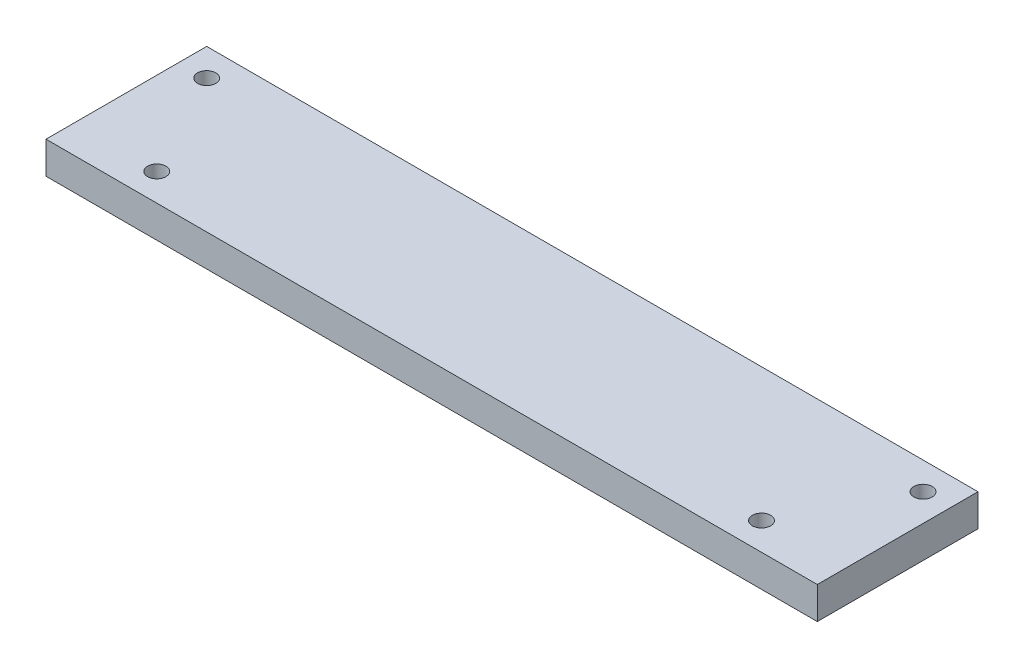
ISO-10303-21;
HEADER;
FILE_DESCRIPTION(('STEP AP214'),'2;1');
FILE_NAME('part.step','',(''),(''),'','','');
FILE_SCHEMA(('AUTOMOTIVE_DESIGN { 1 0 10303 214 1 1 1 1 }'));
ENDSEC;
DATA;
#1=APPLICATION_CONTEXT('core data for automotive mechanical design processes');
#2=APPLICATION_PROTOCOL_DEFINITION('international standard','automotive_design',2000,#1);
#3=PRODUCT_CONTEXT('',#1,'mechanical');
#4=PRODUCT('Part','Part','',(#3));
#5=PRODUCT_RELATED_PRODUCT_CATEGORY('part','',(#4));
#6=PRODUCT_DEFINITION_FORMATION('','',#4);
#7=PRODUCT_DEFINITION_CONTEXT('part definition',#1,'design');
#8=PRODUCT_DEFINITION('design','',#6,#7);
#9=PRODUCT_DEFINITION_SHAPE('','',#8);
#10=(LENGTH_UNIT() NAMED_UNIT(*) SI_UNIT(.MILLI.,.METRE.));
#11=(NAMED_UNIT(*) PLANE_ANGLE_UNIT() SI_UNIT($,.RADIAN.));
#12=(NAMED_UNIT(*) SI_UNIT($,.STERADIAN.) SOLID_ANGLE_UNIT());
#13=UNCERTAINTY_MEASURE_WITH_UNIT(LENGTH_MEASURE(1.E-05),#10,'distance_accuracy_value','');
#14=(GEOMETRIC_REPRESENTATION_CONTEXT(3) GLOBAL_UNCERTAINTY_ASSIGNED_CONTEXT((#13)) GLOBAL_UNIT_ASSIGNED_CONTEXT((#10,
#11,#12)) REPRESENTATION_CONTEXT('',''));
#15=CARTESIAN_POINT('',(0.,0.,0.));
#16=DIRECTION('',(0.,0.,1.));
#17=DIRECTION('',(1.,0.,0.));
#18=AXIS2_PLACEMENT_3D('',#15,#16,#17);
#19=CARTESIAN_POINT('',(0.,12.7,0.));
#20=DIRECTION('',(0.,-1.,0.));
#21=DIRECTION('',(0.,0.,-1.));
#22=AXIS2_PLACEMENT_3D('',#19,#20,#21);
#23=PLANE('',#22);
#24=DIRECTION('',(0.,0.,1.));
#25=VECTOR('',#24,1.);
#26=CARTESIAN_POINT('',(0.,12.7,0.));
#27=LINE('',#26,#25);
#28=CARTESIAN_POINT('',(0.,12.7,-63.5));
#29=VERTEX_POINT('',#28);
#30=CARTESIAN_POINT('',(0.,12.7,0.));
#31=VERTEX_POINT('',#30);
#32=EDGE_CURVE('E84',#29,#31,#27,.T.);
#33=ORIENTED_EDGE('',*,*,#32,.T.);
#34=DIRECTION('',(1.,0.,0.));
#35=VECTOR('',#34,1.);
#36=CARTESIAN_POINT('',(0.,12.7,0.));
#37=LINE('',#36,#35);
#38=CARTESIAN_POINT('',(304.8,12.7,0.));
#39=VERTEX_POINT('',#38);
#40=EDGE_CURVE('E79',#31,#39,#37,.T.);
#41=ORIENTED_EDGE('',*,*,#40,.T.);
#42=DIRECTION('',(0.,0.,-1.));
#43=VECTOR('',#42,1.);
#44=CARTESIAN_POINT('',(304.8,12.7,0.));
#45=LINE('',#44,#43);
#46=CARTESIAN_POINT('',(304.8,12.7,-63.5));
#47=VERTEX_POINT('',#46);
#48=EDGE_CURVE('E82',#39,#47,#45,.T.);
#49=ORIENTED_EDGE('',*,*,#48,.T.);
#50=DIRECTION('',(-1.,0.,0.));
#51=VECTOR('',#50,1.);
#52=CARTESIAN_POINT('',(0.,12.7,-63.5));
#53=LINE('',#52,#51);
#54=EDGE_CURVE('E49',#47,#29,#53,.T.);
#55=ORIENTED_EDGE('',*,*,#54,.T.);
#56=EDGE_LOOP('',(#33,#41,#49,#55));
#57=FACE_BOUND('',#56,.T.);
#58=CARTESIAN_POINT('',(293.9415,12.7,-52.6415));
#59=DIRECTION('',(0.,1.,0.));
#60=DIRECTION('',(0.,0.,1.));
#61=AXIS2_PLACEMENT_3D('',#58,#59,#60);
#62=CIRCLE('',#61,3.61949999999999);
#63=CARTESIAN_POINT('',(293.9415,12.7,-49.022));
#64=VERTEX_POINT('',#63);
#65=EDGE_CURVE('E99',#64,#64,#62,.T.);
#66=ORIENTED_EDGE('',*,*,#65,.F.);
#67=EDGE_LOOP('',(#66));
#68=FACE_BOUND('',#67,.T.);
#69=CARTESIAN_POINT('',(271.892090778889,12.7,-10.8585));
#70=DIRECTION('',(0.,1.,0.));
#71=DIRECTION('',(0.,0.,1.));
#72=AXIS2_PLACEMENT_3D('',#69,#70,#71);
#73=CIRCLE('',#72,3.61949999999999);
#74=CARTESIAN_POINT('',(271.892090778889,12.7,-7.23900000000001));
#75=VERTEX_POINT('',#74);
#76=EDGE_CURVE('E114',#75,#75,#73,.T.);
#77=ORIENTED_EDGE('',*,*,#76,.F.);
#78=EDGE_LOOP('',(#77));
#79=FACE_BOUND('',#78,.T.);
#80=CARTESIAN_POINT('',(32.9079092211106,12.7,-10.8585));
#81=DIRECTION('',(0.,1.,0.));
#82=DIRECTION('',(0.,0.,-1.));
#83=AXIS2_PLACEMENT_3D('',#80,#81,#82);
#84=CIRCLE('',#83,3.6195);
#85=CARTESIAN_POINT('',(32.9079092211106,12.7,-14.478));
#86=VERTEX_POINT('',#85);
#87=EDGE_CURVE('E120',#86,#86,#84,.T.);
#88=ORIENTED_EDGE('',*,*,#87,.F.);
#89=EDGE_LOOP('',(#88));
#90=FACE_BOUND('',#89,.T.);
#91=CARTESIAN_POINT('',(10.8585,12.7,-52.6415));
#92=DIRECTION('',(0.,1.,0.));
#93=DIRECTION('',(0.,0.,-1.));
#94=AXIS2_PLACEMENT_3D('',#91,#92,#93);
#95=CIRCLE('',#94,3.6195);
#96=CARTESIAN_POINT('',(10.8585,12.7,-56.261));
#97=VERTEX_POINT('',#96);
#98=EDGE_CURVE('E126',#97,#97,#95,.T.);
#99=ORIENTED_EDGE('',*,*,#98,.F.);
#100=EDGE_LOOP('',(#99));
#101=FACE_BOUND('',#100,.T.);
#102=ADVANCED_FACE('F32',(#57,#68,#79,#90,#101),#23,.F.);
#103=CARTESIAN_POINT('',(0.,0.,0.));
#104=DIRECTION('',(0.,-1.,0.));
#105=DIRECTION('',(0.,0.,-1.));
#106=AXIS2_PLACEMENT_3D('',#103,#104,#105);
#107=PLANE('',#106);
#108=CARTESIAN_POINT('',(32.9079092211106,0.,-10.8585));
#109=DIRECTION('',(0.,1.,0.));
#110=DIRECTION('',(0.,0.,-1.));
#111=AXIS2_PLACEMENT_3D('',#108,#109,#110);
#112=CIRCLE('',#111,3.6195);
#113=CARTESIAN_POINT('',(32.9079092211106,0.,-14.478));
#114=VERTEX_POINT('',#113);
#115=EDGE_CURVE('E123',#114,#114,#112,.T.);
#116=ORIENTED_EDGE('',*,*,#115,.T.);
#117=EDGE_LOOP('',(#116));
#118=FACE_BOUND('',#117,.T.);
#119=CARTESIAN_POINT('',(293.9415,0.,-52.6415));
#120=DIRECTION('',(0.,1.,0.));
#121=DIRECTION('',(0.,0.,1.));
#122=AXIS2_PLACEMENT_3D('',#119,#120,#121);
#123=CIRCLE('',#122,3.61949999999999);
#124=CARTESIAN_POINT('',(293.9415,0.,-49.022));
#125=VERTEX_POINT('',#124);
#126=EDGE_CURVE('E111',#125,#125,#123,.T.);
#127=ORIENTED_EDGE('',*,*,#126,.T.);
#128=EDGE_LOOP('',(#127));
#129=FACE_BOUND('',#128,.T.);
#130=DIRECTION('',(0.,0.,1.));
#131=VECTOR('',#130,1.);
#132=CARTESIAN_POINT('',(0.,0.,0.));
#133=LINE('',#132,#131);
#134=CARTESIAN_POINT('',(0.,0.,-63.5));
#135=VERTEX_POINT('',#134);
#136=CARTESIAN_POINT('',(0.,0.,0.));
#137=VERTEX_POINT('',#136);
#138=EDGE_CURVE('E96',#135,#137,#133,.T.);
#139=ORIENTED_EDGE('',*,*,#138,.F.);
#140=DIRECTION('',(-1.,0.,0.));
#141=VECTOR('',#140,1.);
#142=CARTESIAN_POINT('',(0.,0.,-63.5));
#143=LINE('',#142,#141);
#144=CARTESIAN_POINT('',(304.8,0.,-63.5));
#145=VERTEX_POINT('',#144);
#146=EDGE_CURVE('E72',#145,#135,#143,.T.);
#147=ORIENTED_EDGE('',*,*,#146,.F.);
#148=DIRECTION('',(0.,0.,-1.));
#149=VECTOR('',#148,1.);
#150=CARTESIAN_POINT('',(304.8,0.,0.));
#151=LINE('',#150,#149);
#152=CARTESIAN_POINT('',(304.8,0.,0.));
#153=VERTEX_POINT('',#152);
#154=EDGE_CURVE('E66',#153,#145,#151,.T.);
#155=ORIENTED_EDGE('',*,*,#154,.F.);
#156=DIRECTION('',(1.,0.,0.));
#157=VECTOR('',#156,1.);
#158=CARTESIAN_POINT('',(0.,0.,0.));
#159=LINE('',#158,#157);
#160=EDGE_CURVE('E88',#137,#153,#159,.T.);
#161=ORIENTED_EDGE('',*,*,#160,.F.);
#162=EDGE_LOOP('',(#139,#147,#155,#161));
#163=FACE_BOUND('',#162,.T.);
#164=CARTESIAN_POINT('',(271.892090778889,0.,-10.8585));
#165=DIRECTION('',(0.,1.,0.));
#166=DIRECTION('',(0.,0.,1.));
#167=AXIS2_PLACEMENT_3D('',#164,#165,#166);
#168=CIRCLE('',#167,3.61949999999999);
#169=CARTESIAN_POINT('',(271.892090778889,0.,-7.23900000000001));
#170=VERTEX_POINT('',#169);
#171=EDGE_CURVE('E117',#170,#170,#168,.T.);
#172=ORIENTED_EDGE('',*,*,#171,.T.);
#173=EDGE_LOOP('',(#172));
#174=FACE_BOUND('',#173,.T.);
#175=CARTESIAN_POINT('',(10.8585,0.,-52.6415));
#176=DIRECTION('',(0.,1.,0.));
#177=DIRECTION('',(0.,0.,-1.));
#178=AXIS2_PLACEMENT_3D('',#175,#176,#177);
#179=CIRCLE('',#178,3.6195);
#180=CARTESIAN_POINT('',(10.8585,0.,-56.261));
#181=VERTEX_POINT('',#180);
#182=EDGE_CURVE('E129',#181,#181,#179,.T.);
#183=ORIENTED_EDGE('',*,*,#182,.T.);
#184=EDGE_LOOP('',(#183));
#185=FACE_BOUND('',#184,.T.);
#186=ADVANCED_FACE('F107',(#118,#129,#163,#174,#185),#107,.T.);
#187=CARTESIAN_POINT('',(0.,12.7,0.));
#188=DIRECTION('',(1.,0.,0.));
#189=DIRECTION('',(0.,0.,-1.));
#190=AXIS2_PLACEMENT_3D('',#187,#188,#189);
#191=PLANE('',#190);
#192=ORIENTED_EDGE('',*,*,#138,.T.);
#193=DIRECTION('',(0.,-1.,0.));
#194=VECTOR('',#193,1.);
#195=CARTESIAN_POINT('',(0.,12.7,0.));
#196=LINE('',#195,#194);
#197=EDGE_CURVE('E11',#31,#137,#196,.T.);
#198=ORIENTED_EDGE('',*,*,#197,.F.);
#199=ORIENTED_EDGE('',*,*,#32,.F.);
#200=DIRECTION('',(0.,-1.,0.));
#201=VECTOR('',#200,1.);
#202=CARTESIAN_POINT('',(0.,12.7,-63.5));
#203=LINE('',#202,#201);
#204=EDGE_CURVE('E92',#29,#135,#203,.T.);
#205=ORIENTED_EDGE('',*,*,#204,.T.);
#206=EDGE_LOOP('',(#192,#198,#199,#205));
#207=FACE_BOUND('',#206,.T.);
#208=ADVANCED_FACE('F34',(#207),#191,.F.);
#209=CARTESIAN_POINT('',(0.,12.7,0.));
#210=DIRECTION('',(0.,0.,-1.));
#211=DIRECTION('',(-1.,0.,0.));
#212=AXIS2_PLACEMENT_3D('',#209,#210,#211);
#213=PLANE('',#212);
#214=ORIENTED_EDGE('',*,*,#160,.T.);
#215=DIRECTION('',(0.,-1.,0.));
#216=VECTOR('',#215,1.);
#217=CARTESIAN_POINT('',(304.8,12.7,0.));
#218=LINE('',#217,#216);
#219=EDGE_CURVE('E41',#39,#153,#218,.T.);
#220=ORIENTED_EDGE('',*,*,#219,.F.);
#221=ORIENTED_EDGE('',*,*,#40,.F.);
#222=ORIENTED_EDGE('',*,*,#197,.T.);
#223=EDGE_LOOP('',(#214,#220,#221,#222));
#224=FACE_BOUND('',#223,.T.);
#225=ADVANCED_FACE('F87',(#224),#213,.F.);
#226=CARTESIAN_POINT('',(304.8,12.7,0.));
#227=DIRECTION('',(-1.,0.,0.));
#228=DIRECTION('',(0.,0.,1.));
#229=AXIS2_PLACEMENT_3D('',#226,#227,#228);
#230=PLANE('',#229);
#231=ORIENTED_EDGE('',*,*,#154,.T.);
#232=DIRECTION('',(0.,-1.,0.));
#233=VECTOR('',#232,1.);
#234=CARTESIAN_POINT('',(304.8,12.7,-63.5));
#235=LINE('',#234,#233);
#236=EDGE_CURVE('E89',#47,#145,#235,.T.);
#237=ORIENTED_EDGE('',*,*,#236,.F.);
#238=ORIENTED_EDGE('',*,*,#48,.F.);
#239=ORIENTED_EDGE('',*,*,#219,.T.);
#240=EDGE_LOOP('',(#231,#237,#238,#239));
#241=FACE_BOUND('',#240,.T.);
#242=ADVANCED_FACE('F90',(#241),#230,.F.);
#243=CARTESIAN_POINT('',(0.,12.7,-63.5));
#244=DIRECTION('',(0.,0.,1.));
#245=DIRECTION('',(1.,0.,0.));
#246=AXIS2_PLACEMENT_3D('',#243,#244,#245);
#247=PLANE('',#246);
#248=ORIENTED_EDGE('',*,*,#146,.T.);
#249=ORIENTED_EDGE('',*,*,#204,.F.);
#250=ORIENTED_EDGE('',*,*,#54,.F.);
#251=ORIENTED_EDGE('',*,*,#236,.T.);
#252=EDGE_LOOP('',(#248,#249,#250,#251));
#253=FACE_BOUND('',#252,.T.);
#254=ADVANCED_FACE('F104',(#253),#247,.F.);
#255=CARTESIAN_POINT('',(293.9415,12.7,-52.6415));
#256=DIRECTION('',(0.,-1.,0.));
#257=DIRECTION('',(0.,0.,-1.));
#258=AXIS2_PLACEMENT_3D('',#255,#256,#257);
#259=CYLINDRICAL_SURFACE('',#258,3.61949999999999);
#260=ORIENTED_EDGE('',*,*,#65,.T.);
#261=EDGE_LOOP('',(#260));
#262=FACE_BOUND('',#261,.T.);
#263=ORIENTED_EDGE('',*,*,#126,.F.);
#264=EDGE_LOOP('',(#263));
#265=FACE_BOUND('',#264,.T.);
#266=ADVANCED_FACE('F146',(#262,#265),#259,.F.);
#267=CARTESIAN_POINT('',(271.892090778889,12.7,-10.8585));
#268=DIRECTION('',(0.,-1.,0.));
#269=DIRECTION('',(0.,0.,-1.));
#270=AXIS2_PLACEMENT_3D('',#267,#268,#269);
#271=CYLINDRICAL_SURFACE('',#270,3.61949999999999);
#272=ORIENTED_EDGE('',*,*,#76,.T.);
#273=EDGE_LOOP('',(#272));
#274=FACE_BOUND('',#273,.T.);
#275=ORIENTED_EDGE('',*,*,#171,.F.);
#276=EDGE_LOOP('',(#275));
#277=FACE_BOUND('',#276,.T.);
#278=ADVANCED_FACE('F192',(#274,#277),#271,.F.);
#279=CARTESIAN_POINT('',(32.9079092211106,12.7,-10.8585));
#280=DIRECTION('',(0.,-1.,0.));
#281=DIRECTION('',(0.,0.,-1.));
#282=AXIS2_PLACEMENT_3D('',#279,#280,#281);
#283=CYLINDRICAL_SURFACE('',#282,3.6195);
#284=ORIENTED_EDGE('',*,*,#87,.T.);
#285=EDGE_LOOP('',(#284));
#286=FACE_BOUND('',#285,.T.);
#287=ORIENTED_EDGE('',*,*,#115,.F.);
#288=EDGE_LOOP('',(#287));
#289=FACE_BOUND('',#288,.T.);
#290=ADVANCED_FACE('F200',(#286,#289),#283,.F.);
#291=CARTESIAN_POINT('',(10.8585,12.7,-52.6415));
#292=DIRECTION('',(0.,-1.,0.));
#293=DIRECTION('',(0.,0.,-1.));
#294=AXIS2_PLACEMENT_3D('',#291,#292,#293);
#295=CYLINDRICAL_SURFACE('',#294,3.6195);
#296=ORIENTED_EDGE('',*,*,#98,.T.);
#297=EDGE_LOOP('',(#296));
#298=FACE_BOUND('',#297,.T.);
#299=ORIENTED_EDGE('',*,*,#182,.F.);
#300=EDGE_LOOP('',(#299));
#301=FACE_BOUND('',#300,.T.);
#302=ADVANCED_FACE('F135',(#298,#301),#295,.F.);
#303=CLOSED_SHELL('',(#102,#186,#208,#225,#242,#254,#266,#278,#290,#302));
#304=MANIFOLD_SOLID_BREP('B2',#303);
#305=ADVANCED_BREP_SHAPE_REPRESENTATION('',(#18,#304),#14);
#306=SHAPE_DEFINITION_REPRESENTATION(#9,#305);
ENDSEC;
END-ISO-10303-21;
